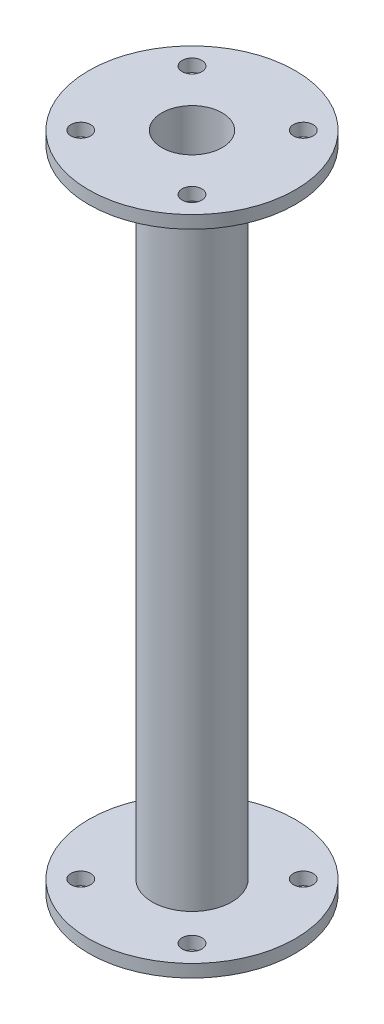
ISO-10303-21;
HEADER;
FILE_DESCRIPTION(('STEP AP214'),'2;1');
FILE_NAME('part.step','',(''),(''),'','','');
FILE_SCHEMA(('AUTOMOTIVE_DESIGN { 1 0 10303 214 1 1 1 1 }'));
ENDSEC;
DATA;
#1=APPLICATION_CONTEXT('core data for automotive mechanical design processes');
#2=APPLICATION_PROTOCOL_DEFINITION('international standard','automotive_design',2000,#1);
#3=PRODUCT_CONTEXT('',#1,'mechanical');
#4=PRODUCT('Part','Part','',(#3));
#5=PRODUCT_RELATED_PRODUCT_CATEGORY('part','',(#4));
#6=PRODUCT_DEFINITION_FORMATION('','',#4);
#7=PRODUCT_DEFINITION_CONTEXT('part definition',#1,'design');
#8=PRODUCT_DEFINITION('design','',#6,#7);
#9=PRODUCT_DEFINITION_SHAPE('','',#8);
#10=(LENGTH_UNIT() NAMED_UNIT(*) SI_UNIT(.MILLI.,.METRE.));
#11=(NAMED_UNIT(*) PLANE_ANGLE_UNIT() SI_UNIT($,.RADIAN.));
#12=(NAMED_UNIT(*) SI_UNIT($,.STERADIAN.) SOLID_ANGLE_UNIT());
#13=UNCERTAINTY_MEASURE_WITH_UNIT(LENGTH_MEASURE(1.E-05),#10,'distance_accuracy_value','');
#14=(GEOMETRIC_REPRESENTATION_CONTEXT(3) GLOBAL_UNCERTAINTY_ASSIGNED_CONTEXT((#13)) GLOBAL_UNIT_ASSIGNED_CONTEXT((#10,
#11,#12)) REPRESENTATION_CONTEXT('',''));
#15=CARTESIAN_POINT('',(0.,0.,0.));
#16=DIRECTION('',(0.,0.,1.));
#17=DIRECTION('',(1.,0.,0.));
#18=AXIS2_PLACEMENT_3D('',#15,#16,#17);
#19=CARTESIAN_POINT('',(0.,4.,0.));
#20=DIRECTION('',(0.,1.,0.));
#21=DIRECTION('',(0.,0.,1.));
#22=AXIS2_PLACEMENT_3D('',#19,#20,#21);
#23=PLANE('',#22);
#24=CARTESIAN_POINT('',(-17.5,4.,17.5));
#25=DIRECTION('',(0.,1.,0.));
#26=DIRECTION('',(0.,0.,1.));
#27=AXIS2_PLACEMENT_3D('',#24,#25,#26);
#28=CIRCLE('',#27,3.1);
#29=CARTESIAN_POINT('',(-17.5,4.,20.6));
#30=VERTEX_POINT('',#29);
#31=EDGE_CURVE('E62',#30,#30,#28,.T.);
#32=ORIENTED_EDGE('',*,*,#31,.F.);
#33=EDGE_LOOP('',(#32));
#34=FACE_BOUND('',#33,.T.);
#35=CARTESIAN_POINT('',(17.5,4.,-17.5));
#36=DIRECTION('',(0.,1.,0.));
#37=DIRECTION('',(0.,0.,1.));
#38=AXIS2_PLACEMENT_3D('',#35,#36,#37);
#39=CIRCLE('',#38,3.1);
#40=CARTESIAN_POINT('',(17.5,4.,-14.4));
#41=VERTEX_POINT('',#40);
#42=EDGE_CURVE('E50',#41,#41,#39,.T.);
#43=ORIENTED_EDGE('',*,*,#42,.F.);
#44=EDGE_LOOP('',(#43));
#45=FACE_BOUND('',#44,.T.);
#46=CARTESIAN_POINT('',(0.,4.,0.));
#47=DIRECTION('',(0.,1.,0.));
#48=DIRECTION('',(0.,0.,1.));
#49=AXIS2_PLACEMENT_3D('',#46,#47,#48);
#50=CIRCLE('',#49,32.5);
#51=CARTESIAN_POINT('',(0.,4.,32.5));
#52=VERTEX_POINT('',#51);
#53=EDGE_CURVE('E10',#52,#52,#50,.T.);
#54=ORIENTED_EDGE('',*,*,#53,.T.);
#55=EDGE_LOOP('',(#54));
#56=FACE_BOUND('',#55,.T.);
#57=CARTESIAN_POINT('',(-17.5,4.,-17.5));
#58=DIRECTION('',(0.,1.,0.));
#59=DIRECTION('',(0.,0.,1.));
#60=AXIS2_PLACEMENT_3D('',#57,#58,#59);
#61=CIRCLE('',#60,3.1);
#62=CARTESIAN_POINT('',(-17.5,4.,-14.4));
#63=VERTEX_POINT('',#62);
#64=EDGE_CURVE('E46',#63,#63,#61,.T.);
#65=ORIENTED_EDGE('',*,*,#64,.F.);
#66=EDGE_LOOP('',(#65));
#67=FACE_BOUND('',#66,.T.);
#68=CARTESIAN_POINT('',(17.5,4.,17.5));
#69=DIRECTION('',(0.,1.,0.));
#70=DIRECTION('',(0.,0.,1.));
#71=AXIS2_PLACEMENT_3D('',#68,#69,#70);
#72=CIRCLE('',#71,3.1);
#73=CARTESIAN_POINT('',(17.5,4.,20.6));
#74=VERTEX_POINT('',#73);
#75=EDGE_CURVE('E56',#74,#74,#72,.T.);
#76=ORIENTED_EDGE('',*,*,#75,.F.);
#77=EDGE_LOOP('',(#76));
#78=FACE_BOUND('',#77,.T.);
#79=CARTESIAN_POINT('',(0.,4.,0.));
#80=DIRECTION('',(0.,1.,0.));
#81=DIRECTION('',(0.,0.,1.));
#82=AXIS2_PLACEMENT_3D('',#79,#80,#81);
#83=CIRCLE('',#82,12.5);
#84=CARTESIAN_POINT('',(0.,4.,12.5));
#85=VERTEX_POINT('',#84);
#86=EDGE_CURVE('E71',#85,#85,#83,.T.);
#87=ORIENTED_EDGE('',*,*,#86,.F.);
#88=EDGE_LOOP('',(#87));
#89=FACE_BOUND('',#88,.T.);
#90=ADVANCED_FACE('F31',(#34,#45,#56,#67,#78,#89),#23,.T.);
#91=CARTESIAN_POINT('',(0.,0.,0.));
#92=DIRECTION('',(0.,1.,0.));
#93=DIRECTION('',(0.,0.,1.));
#94=AXIS2_PLACEMENT_3D('',#91,#92,#93);
#95=PLANE('',#94);
#96=CARTESIAN_POINT('',(17.5,0.,17.5));
#97=DIRECTION('',(0.,1.,0.));
#98=DIRECTION('',(0.,0.,1.));
#99=AXIS2_PLACEMENT_3D('',#96,#97,#98);
#100=CIRCLE('',#99,3.1);
#101=CARTESIAN_POINT('',(17.5,0.,20.6));
#102=VERTEX_POINT('',#101);
#103=EDGE_CURVE('E59',#102,#102,#100,.T.);
#104=ORIENTED_EDGE('',*,*,#103,.T.);
#105=EDGE_LOOP('',(#104));
#106=FACE_BOUND('',#105,.T.);
#107=CARTESIAN_POINT('',(-17.5,0.,-17.5));
#108=DIRECTION('',(0.,1.,0.));
#109=DIRECTION('',(0.,0.,1.));
#110=AXIS2_PLACEMENT_3D('',#107,#108,#109);
#111=CIRCLE('',#110,3.1);
#112=CARTESIAN_POINT('',(-17.5,0.,-14.4));
#113=VERTEX_POINT('',#112);
#114=EDGE_CURVE('E47',#113,#113,#111,.T.);
#115=ORIENTED_EDGE('',*,*,#114,.T.);
#116=EDGE_LOOP('',(#115));
#117=FACE_BOUND('',#116,.T.);
#118=CARTESIAN_POINT('',(0.,0.,0.));
#119=DIRECTION('',(0.,1.,0.));
#120=DIRECTION('',(0.,0.,1.));
#121=AXIS2_PLACEMENT_3D('',#118,#119,#120);
#122=CIRCLE('',#121,32.5);
#123=CARTESIAN_POINT('',(0.,0.,32.5));
#124=VERTEX_POINT('',#123);
#125=EDGE_CURVE('E35',#124,#124,#122,.T.);
#126=ORIENTED_EDGE('',*,*,#125,.F.);
#127=EDGE_LOOP('',(#126));
#128=FACE_BOUND('',#127,.T.);
#129=CARTESIAN_POINT('',(0.,0.,0.));
#130=DIRECTION('',(0.,1.,0.));
#131=DIRECTION('',(0.,0.,1.));
#132=AXIS2_PLACEMENT_3D('',#129,#130,#131);
#133=CIRCLE('',#132,9.5);
#134=CARTESIAN_POINT('',(0.,0.,9.5));
#135=VERTEX_POINT('',#134);
#136=EDGE_CURVE('E42',#135,#135,#133,.T.);
#137=ORIENTED_EDGE('',*,*,#136,.T.);
#138=EDGE_LOOP('',(#137));
#139=FACE_BOUND('',#138,.T.);
#140=CARTESIAN_POINT('',(17.5,0.,-17.5));
#141=DIRECTION('',(0.,1.,0.));
#142=DIRECTION('',(0.,0.,1.));
#143=AXIS2_PLACEMENT_3D('',#140,#141,#142);
#144=CIRCLE('',#143,3.1);
#145=CARTESIAN_POINT('',(17.5,0.,-14.4));
#146=VERTEX_POINT('',#145);
#147=EDGE_CURVE('E53',#146,#146,#144,.T.);
#148=ORIENTED_EDGE('',*,*,#147,.T.);
#149=EDGE_LOOP('',(#148));
#150=FACE_BOUND('',#149,.T.);
#151=CARTESIAN_POINT('',(-17.5,0.,17.5));
#152=DIRECTION('',(0.,1.,0.));
#153=DIRECTION('',(0.,0.,1.));
#154=AXIS2_PLACEMENT_3D('',#151,#152,#153);
#155=CIRCLE('',#154,3.1);
#156=CARTESIAN_POINT('',(-17.5,0.,20.6));
#157=VERTEX_POINT('',#156);
#158=EDGE_CURVE('E65',#157,#157,#155,.T.);
#159=ORIENTED_EDGE('',*,*,#158,.T.);
#160=EDGE_LOOP('',(#159));
#161=FACE_BOUND('',#160,.T.);
#162=ADVANCED_FACE('F132',(#106,#117,#128,#139,#150,#161),#95,.F.);
#163=CARTESIAN_POINT('',(0.,4.,0.));
#164=DIRECTION('',(0.,-1.,0.));
#165=DIRECTION('',(0.,0.,-1.));
#166=AXIS2_PLACEMENT_3D('',#163,#164,#165);
#167=CYLINDRICAL_SURFACE('',#166,32.5);
#168=ORIENTED_EDGE('',*,*,#53,.F.);
#169=EDGE_LOOP('',(#168));
#170=FACE_BOUND('',#169,.T.);
#171=ORIENTED_EDGE('',*,*,#125,.T.);
#172=EDGE_LOOP('',(#171));
#173=FACE_BOUND('',#172,.T.);
#174=ADVANCED_FACE('F33',(#170,#173),#167,.T.);
#175=CARTESIAN_POINT('',(0.,4.,0.));
#176=DIRECTION('',(0.,-1.,0.));
#177=DIRECTION('',(0.,0.,-1.));
#178=AXIS2_PLACEMENT_3D('',#175,#176,#177);
#179=CYLINDRICAL_SURFACE('',#178,9.5);
#180=ORIENTED_EDGE('',*,*,#136,.F.);
#181=EDGE_LOOP('',(#180));
#182=FACE_BOUND('',#181,.T.);
#183=CARTESIAN_POINT('',(0.,208.,0.));
#184=DIRECTION('',(0.,1.,0.));
#185=DIRECTION('',(0.,0.,1.));
#186=AXIS2_PLACEMENT_3D('',#183,#184,#185);
#187=CIRCLE('',#186,9.5);
#188=CARTESIAN_POINT('',(0.,208.,9.5));
#189=VERTEX_POINT('',#188);
#190=EDGE_CURVE('E104',#189,#189,#187,.T.);
#191=ORIENTED_EDGE('',*,*,#190,.T.);
#192=EDGE_LOOP('',(#191));
#193=FACE_BOUND('',#192,.T.);
#194=ADVANCED_FACE('F110',(#182,#193),#179,.F.);
#195=CARTESIAN_POINT('',(-17.5,4.,-17.5));
#196=DIRECTION('',(0.,-1.,0.));
#197=DIRECTION('',(0.,0.,-1.));
#198=AXIS2_PLACEMENT_3D('',#195,#196,#197);
#199=CYLINDRICAL_SURFACE('',#198,3.1);
#200=ORIENTED_EDGE('',*,*,#64,.T.);
#201=EDGE_LOOP('',(#200));
#202=FACE_BOUND('',#201,.T.);
#203=ORIENTED_EDGE('',*,*,#114,.F.);
#204=EDGE_LOOP('',(#203));
#205=FACE_BOUND('',#204,.T.);
#206=ADVANCED_FACE('F144',(#202,#205),#199,.F.);
#207=CARTESIAN_POINT('',(17.5,4.,-17.5));
#208=DIRECTION('',(0.,-1.,0.));
#209=DIRECTION('',(0.,0.,-1.));
#210=AXIS2_PLACEMENT_3D('',#207,#208,#209);
#211=CYLINDRICAL_SURFACE('',#210,3.1);
#212=ORIENTED_EDGE('',*,*,#42,.T.);
#213=EDGE_LOOP('',(#212));
#214=FACE_BOUND('',#213,.T.);
#215=ORIENTED_EDGE('',*,*,#147,.F.);
#216=EDGE_LOOP('',(#215));
#217=FACE_BOUND('',#216,.T.);
#218=ADVANCED_FACE('F148',(#214,#217),#211,.F.);
#219=CARTESIAN_POINT('',(17.5,4.,17.5));
#220=DIRECTION('',(0.,-1.,0.));
#221=DIRECTION('',(0.,0.,-1.));
#222=AXIS2_PLACEMENT_3D('',#219,#220,#221);
#223=CYLINDRICAL_SURFACE('',#222,3.1);
#224=ORIENTED_EDGE('',*,*,#75,.T.);
#225=EDGE_LOOP('',(#224));
#226=FACE_BOUND('',#225,.T.);
#227=ORIENTED_EDGE('',*,*,#103,.F.);
#228=EDGE_LOOP('',(#227));
#229=FACE_BOUND('',#228,.T.);
#230=ADVANCED_FACE('F152',(#226,#229),#223,.F.);
#231=CARTESIAN_POINT('',(-17.5,4.,17.5));
#232=DIRECTION('',(0.,-1.,0.));
#233=DIRECTION('',(0.,0.,-1.));
#234=AXIS2_PLACEMENT_3D('',#231,#232,#233);
#235=CYLINDRICAL_SURFACE('',#234,3.1);
#236=ORIENTED_EDGE('',*,*,#31,.T.);
#237=EDGE_LOOP('',(#236));
#238=FACE_BOUND('',#237,.T.);
#239=ORIENTED_EDGE('',*,*,#158,.F.);
#240=EDGE_LOOP('',(#239));
#241=FACE_BOUND('',#240,.T.);
#242=ADVANCED_FACE('F156',(#238,#241),#235,.F.);
#243=CARTESIAN_POINT('',(0.,204.,0.));
#244=DIRECTION('',(0.,-1.,0.));
#245=DIRECTION('',(0.,0.,-1.));
#246=AXIS2_PLACEMENT_3D('',#243,#244,#245);
#247=CYLINDRICAL_SURFACE('',#246,12.5);
#248=CARTESIAN_POINT('',(0.,204.,0.));
#249=DIRECTION('',(0.,1.,0.));
#250=DIRECTION('',(0.,0.,1.));
#251=AXIS2_PLACEMENT_3D('',#248,#249,#250);
#252=CIRCLE('',#251,12.5);
#253=CARTESIAN_POINT('',(0.,204.,12.5));
#254=VERTEX_POINT('',#253);
#255=EDGE_CURVE('E68',#254,#254,#252,.T.);
#256=ORIENTED_EDGE('',*,*,#255,.F.);
#257=EDGE_LOOP('',(#256));
#258=FACE_BOUND('',#257,.T.);
#259=ORIENTED_EDGE('',*,*,#86,.T.);
#260=EDGE_LOOP('',(#259));
#261=FACE_BOUND('',#260,.T.);
#262=ADVANCED_FACE('F125',(#258,#261),#247,.T.);
#263=CARTESIAN_POINT('',(0.,204.,0.));
#264=DIRECTION('',(0.,1.,0.));
#265=DIRECTION('',(0.,0.,1.));
#266=AXIS2_PLACEMENT_3D('',#263,#264,#265);
#267=PLANE('',#266);
#268=CARTESIAN_POINT('',(17.5,204.,17.5));
#269=DIRECTION('',(0.,1.,0.));
#270=DIRECTION('',(0.,0.,1.));
#271=AXIS2_PLACEMENT_3D('',#268,#269,#270);
#272=CIRCLE('',#271,3.1);
#273=CARTESIAN_POINT('',(17.5,204.,20.6));
#274=VERTEX_POINT('',#273);
#275=EDGE_CURVE('E95',#274,#274,#272,.T.);
#276=ORIENTED_EDGE('',*,*,#275,.T.);
#277=EDGE_LOOP('',(#276));
#278=FACE_BOUND('',#277,.T.);
#279=CARTESIAN_POINT('',(-17.5,204.,-17.5));
#280=DIRECTION('',(0.,1.,0.));
#281=DIRECTION('',(0.,0.,1.));
#282=AXIS2_PLACEMENT_3D('',#279,#280,#281);
#283=CIRCLE('',#282,3.1);
#284=CARTESIAN_POINT('',(-17.5,204.,-14.4));
#285=VERTEX_POINT('',#284);
#286=EDGE_CURVE('E83',#285,#285,#283,.T.);
#287=ORIENTED_EDGE('',*,*,#286,.T.);
#288=EDGE_LOOP('',(#287));
#289=FACE_BOUND('',#288,.T.);
#290=CARTESIAN_POINT('',(0.,204.,0.));
#291=DIRECTION('',(0.,1.,0.));
#292=DIRECTION('',(0.,0.,1.));
#293=AXIS2_PLACEMENT_3D('',#290,#291,#292);
#294=CIRCLE('',#293,32.5);
#295=CARTESIAN_POINT('',(0.,204.,32.5));
#296=VERTEX_POINT('',#295);
#297=EDGE_CURVE('E77',#296,#296,#294,.T.);
#298=ORIENTED_EDGE('',*,*,#297,.F.);
#299=EDGE_LOOP('',(#298));
#300=FACE_BOUND('',#299,.T.);
#301=CARTESIAN_POINT('',(17.5,204.,-17.5));
#302=DIRECTION('',(0.,1.,0.));
#303=DIRECTION('',(0.,0.,1.));
#304=AXIS2_PLACEMENT_3D('',#301,#302,#303);
#305=CIRCLE('',#304,3.1);
#306=CARTESIAN_POINT('',(17.5,204.,-14.4));
#307=VERTEX_POINT('',#306);
#308=EDGE_CURVE('E89',#307,#307,#305,.T.);
#309=ORIENTED_EDGE('',*,*,#308,.T.);
#310=EDGE_LOOP('',(#309));
#311=FACE_BOUND('',#310,.T.);
#312=CARTESIAN_POINT('',(-17.5,204.,17.5));
#313=DIRECTION('',(0.,1.,0.));
#314=DIRECTION('',(0.,0.,1.));
#315=AXIS2_PLACEMENT_3D('',#312,#313,#314);
#316=CIRCLE('',#315,3.1);
#317=CARTESIAN_POINT('',(-17.5,204.,20.6));
#318=VERTEX_POINT('',#317);
#319=EDGE_CURVE('E101',#318,#318,#316,.T.);
#320=ORIENTED_EDGE('',*,*,#319,.T.);
#321=EDGE_LOOP('',(#320));
#322=FACE_BOUND('',#321,.T.);
#323=ORIENTED_EDGE('',*,*,#255,.T.);
#324=EDGE_LOOP('',(#323));
#325=FACE_BOUND('',#324,.T.);
#326=ADVANCED_FACE('F115',(#278,#289,#300,#311,#322,#325),#267,.F.);
#327=CARTESIAN_POINT('',(0.,208.,0.));
#328=DIRECTION('',(0.,1.,0.));
#329=DIRECTION('',(0.,0.,1.));
#330=AXIS2_PLACEMENT_3D('',#327,#328,#329);
#331=PLANE('',#330);
#332=CARTESIAN_POINT('',(-17.5,208.,17.5));
#333=DIRECTION('',(0.,1.,0.));
#334=DIRECTION('',(0.,0.,1.));
#335=AXIS2_PLACEMENT_3D('',#332,#333,#334);
#336=CIRCLE('',#335,3.1);
#337=CARTESIAN_POINT('',(-17.5,208.,20.6));
#338=VERTEX_POINT('',#337);
#339=EDGE_CURVE('E98',#338,#338,#336,.T.);
#340=ORIENTED_EDGE('',*,*,#339,.F.);
#341=EDGE_LOOP('',(#340));
#342=FACE_BOUND('',#341,.T.);
#343=CARTESIAN_POINT('',(17.5,208.,-17.5));
#344=DIRECTION('',(0.,1.,0.));
#345=DIRECTION('',(0.,0.,1.));
#346=AXIS2_PLACEMENT_3D('',#343,#344,#345);
#347=CIRCLE('',#346,3.1);
#348=CARTESIAN_POINT('',(17.5,208.,-14.4));
#349=VERTEX_POINT('',#348);
#350=EDGE_CURVE('E86',#349,#349,#347,.T.);
#351=ORIENTED_EDGE('',*,*,#350,.F.);
#352=EDGE_LOOP('',(#351));
#353=FACE_BOUND('',#352,.T.);
#354=CARTESIAN_POINT('',(0.,208.,0.));
#355=DIRECTION('',(0.,1.,0.));
#356=DIRECTION('',(0.,0.,1.));
#357=AXIS2_PLACEMENT_3D('',#354,#355,#356);
#358=CIRCLE('',#357,32.5);
#359=CARTESIAN_POINT('',(0.,208.,32.5));
#360=VERTEX_POINT('',#359);
#361=EDGE_CURVE('E74',#360,#360,#358,.T.);
#362=ORIENTED_EDGE('',*,*,#361,.T.);
#363=EDGE_LOOP('',(#362));
#364=FACE_BOUND('',#363,.T.);
#365=CARTESIAN_POINT('',(-17.5,208.,-17.5));
#366=DIRECTION('',(0.,1.,0.));
#367=DIRECTION('',(0.,0.,1.));
#368=AXIS2_PLACEMENT_3D('',#365,#366,#367);
#369=CIRCLE('',#368,3.1);
#370=CARTESIAN_POINT('',(-17.5,208.,-14.4));
#371=VERTEX_POINT('',#370);
#372=EDGE_CURVE('E80',#371,#371,#369,.T.);
#373=ORIENTED_EDGE('',*,*,#372,.F.);
#374=EDGE_LOOP('',(#373));
#375=FACE_BOUND('',#374,.T.);
#376=CARTESIAN_POINT('',(17.5,208.,17.5));
#377=DIRECTION('',(0.,1.,0.));
#378=DIRECTION('',(0.,0.,1.));
#379=AXIS2_PLACEMENT_3D('',#376,#377,#378);
#380=CIRCLE('',#379,3.1);
#381=CARTESIAN_POINT('',(17.5,208.,20.6));
#382=VERTEX_POINT('',#381);
#383=EDGE_CURVE('E92',#382,#382,#380,.T.);
#384=ORIENTED_EDGE('',*,*,#383,.F.);
#385=EDGE_LOOP('',(#384));
#386=FACE_BOUND('',#385,.T.);
#387=ORIENTED_EDGE('',*,*,#190,.F.);
#388=EDGE_LOOP('',(#387));
#389=FACE_BOUND('',#388,.T.);
#390=ADVANCED_FACE('F112',(#342,#353,#364,#375,#386,#389),#331,.T.);
#391=CARTESIAN_POINT('',(0.,208.,0.));
#392=DIRECTION('',(0.,-1.,0.));
#393=DIRECTION('',(0.,0.,-1.));
#394=AXIS2_PLACEMENT_3D('',#391,#392,#393);
#395=CYLINDRICAL_SURFACE('',#394,32.5);
#396=ORIENTED_EDGE('',*,*,#361,.F.);
#397=EDGE_LOOP('',(#396));
#398=FACE_BOUND('',#397,.T.);
#399=ORIENTED_EDGE('',*,*,#297,.T.);
#400=EDGE_LOOP('',(#399));
#401=FACE_BOUND('',#400,.T.);
#402=ADVANCED_FACE('F114',(#398,#401),#395,.T.);
#403=CARTESIAN_POINT('',(-17.5,208.,-17.5));
#404=DIRECTION('',(0.,-1.,0.));
#405=DIRECTION('',(0.,0.,-1.));
#406=AXIS2_PLACEMENT_3D('',#403,#404,#405);
#407=CYLINDRICAL_SURFACE('',#406,3.1);
#408=ORIENTED_EDGE('',*,*,#372,.T.);
#409=EDGE_LOOP('',(#408));
#410=FACE_BOUND('',#409,.T.);
#411=ORIENTED_EDGE('',*,*,#286,.F.);
#412=EDGE_LOOP('',(#411));
#413=FACE_BOUND('',#412,.T.);
#414=ADVANCED_FACE('F122',(#410,#413),#407,.F.);
#415=CARTESIAN_POINT('',(17.5,208.,-17.5));
#416=DIRECTION('',(0.,-1.,0.));
#417=DIRECTION('',(0.,0.,-1.));
#418=AXIS2_PLACEMENT_3D('',#415,#416,#417);
#419=CYLINDRICAL_SURFACE('',#418,3.1);
#420=ORIENTED_EDGE('',*,*,#350,.T.);
#421=EDGE_LOOP('',(#420));
#422=FACE_BOUND('',#421,.T.);
#423=ORIENTED_EDGE('',*,*,#308,.F.);
#424=EDGE_LOOP('',(#423));
#425=FACE_BOUND('',#424,.T.);
#426=ADVANCED_FACE('F198',(#422,#425),#419,.F.);
#427=CARTESIAN_POINT('',(17.5,208.,17.5));
#428=DIRECTION('',(0.,-1.,0.));
#429=DIRECTION('',(0.,0.,-1.));
#430=AXIS2_PLACEMENT_3D('',#427,#428,#429);
#431=CYLINDRICAL_SURFACE('',#430,3.1);
#432=ORIENTED_EDGE('',*,*,#383,.T.);
#433=EDGE_LOOP('',(#432));
#434=FACE_BOUND('',#433,.T.);
#435=ORIENTED_EDGE('',*,*,#275,.F.);
#436=EDGE_LOOP('',(#435));
#437=FACE_BOUND('',#436,.T.);
#438=ADVANCED_FACE('F207',(#434,#437),#431,.F.);
#439=CARTESIAN_POINT('',(-17.5,208.,17.5));
#440=DIRECTION('',(0.,-1.,0.));
#441=DIRECTION('',(0.,0.,-1.));
#442=AXIS2_PLACEMENT_3D('',#439,#440,#441);
#443=CYLINDRICAL_SURFACE('',#442,3.1);
#444=ORIENTED_EDGE('',*,*,#339,.T.);
#445=EDGE_LOOP('',(#444));
#446=FACE_BOUND('',#445,.T.);
#447=ORIENTED_EDGE('',*,*,#319,.F.);
#448=EDGE_LOOP('',(#447));
#449=FACE_BOUND('',#448,.T.);
#450=ADVANCED_FACE('F217',(#446,#449),#443,.F.);
#451=CLOSED_SHELL('',(#90,#162,#174,#194,#206,#218,#230,#242,#262,#326,#390,#402,#414,#426,#438,#450));
#452=MANIFOLD_SOLID_BREP('B2',#451);
#453=ADVANCED_BREP_SHAPE_REPRESENTATION('',(#18,#452),#14);
#454=SHAPE_DEFINITION_REPRESENTATION(#9,#453);
ENDSEC;
END-ISO-10303-21;
